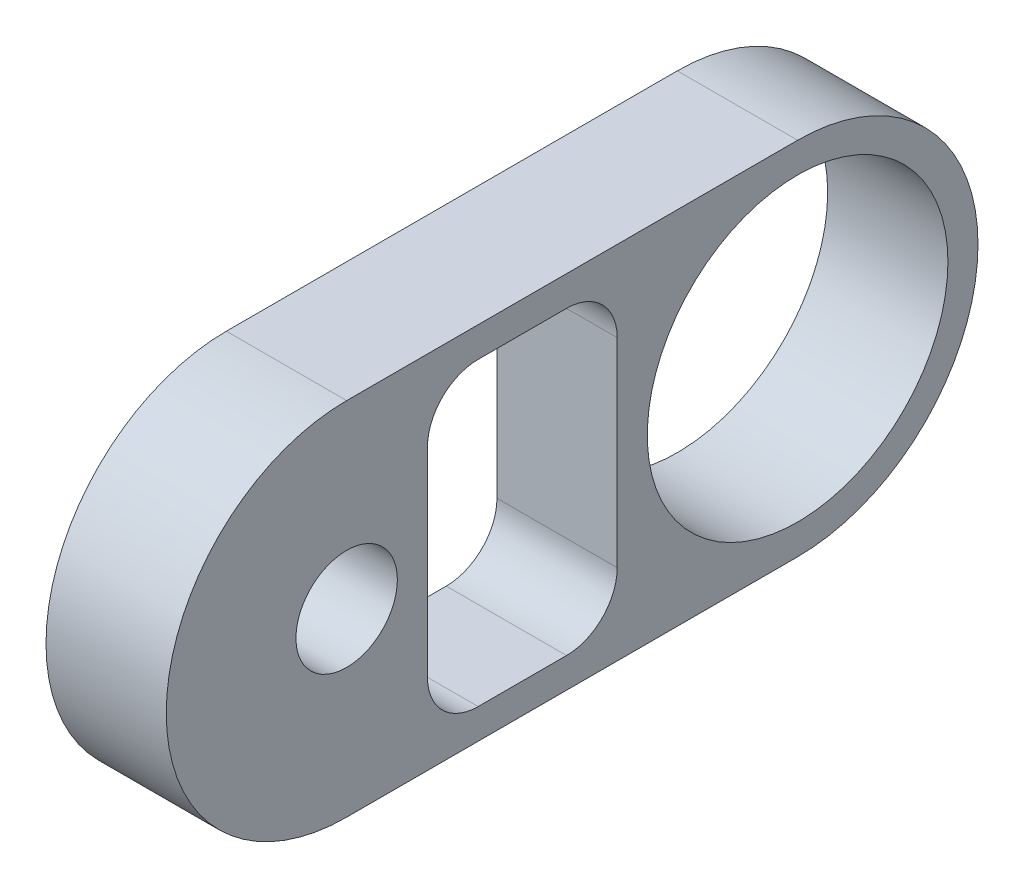
ISO-10303-21;
HEADER;
FILE_DESCRIPTION(('STEP AP214'),'2;1');
FILE_NAME('part.step','',(''),(''),'','','');
FILE_SCHEMA(('AUTOMOTIVE_DESIGN { 1 0 10303 214 1 1 1 1 }'));
ENDSEC;
DATA;
#1=APPLICATION_CONTEXT('core data for automotive mechanical design processes');
#2=APPLICATION_PROTOCOL_DEFINITION('international standard','automotive_design',2000,#1);
#3=PRODUCT_CONTEXT('',#1,'mechanical');
#4=PRODUCT('Part','Part','',(#3));
#5=PRODUCT_RELATED_PRODUCT_CATEGORY('part','',(#4));
#6=PRODUCT_DEFINITION_FORMATION('','',#4);
#7=PRODUCT_DEFINITION_CONTEXT('part definition',#1,'design');
#8=PRODUCT_DEFINITION('design','',#6,#7);
#9=PRODUCT_DEFINITION_SHAPE('','',#8);
#10=(LENGTH_UNIT() NAMED_UNIT(*) SI_UNIT(.MILLI.,.METRE.));
#11=(NAMED_UNIT(*) PLANE_ANGLE_UNIT() SI_UNIT($,.RADIAN.));
#12=(NAMED_UNIT(*) SI_UNIT($,.STERADIAN.) SOLID_ANGLE_UNIT());
#13=UNCERTAINTY_MEASURE_WITH_UNIT(LENGTH_MEASURE(1.E-05),#10,'distance_accuracy_value','');
#14=(GEOMETRIC_REPRESENTATION_CONTEXT(3) GLOBAL_UNCERTAINTY_ASSIGNED_CONTEXT((#13)) GLOBAL_UNIT_ASSIGNED_CONTEXT((#10,
#11,#12)) REPRESENTATION_CONTEXT('',''));
#15=CARTESIAN_POINT('',(0.,0.,0.));
#16=DIRECTION('',(0.,0.,1.));
#17=DIRECTION('',(1.,0.,0.));
#18=AXIS2_PLACEMENT_3D('',#15,#16,#17);
#19=CARTESIAN_POINT('',(10.1599999492,-45.6336193705345,15.3619127645357));
#20=DIRECTION('',(-1.,0.,0.));
#21=DIRECTION('',(0.,0.,1.));
#22=AXIS2_PLACEMENT_3D('',#19,#20,#21);
#23=PLANE('',#22);
#24=DIRECTION('',(0.,1.,0.));
#25=VECTOR('',#24,1.);
#26=CARTESIAN_POINT('',(10.1599999492,-58.3336193705345,-7.49808723546434));
#27=LINE('',#26,#25);
#28=CARTESIAN_POINT('',(10.1599999492,-54.0486393705345,-7.49808723546434));
#29=VERTEX_POINT('',#28);
#30=CARTESIAN_POINT('',(10.1599999492,-37.2185993705345,-7.49808723546434));
#31=VERTEX_POINT('',#30);
#32=EDGE_CURVE('E206',#29,#31,#27,.T.);
#33=ORIENTED_EDGE('',*,*,#32,.F.);
#34=CARTESIAN_POINT('',(10.1599999492,-54.0486393705345,-3.21310723546434));
#35=DIRECTION('',(-1.,0.,0.));
#36=DIRECTION('',(0.,0.,1.));
#37=AXIS2_PLACEMENT_3D('',#34,#35,#36);
#38=CIRCLE('',#37,4.28498);
#39=CARTESIAN_POINT('',(10.1599999492,-58.3336193705345,-3.21310723546434));
#40=VERTEX_POINT('',#39);
#41=EDGE_CURVE('E188',#29,#40,#38,.T.);
#42=ORIENTED_EDGE('',*,*,#41,.T.);
#43=DIRECTION('',(0.,0.,-1.));
#44=VECTOR('',#43,1.);
#45=CARTESIAN_POINT('',(10.1599999492,-58.3336193705345,8.53693276453566));
#46=LINE('',#45,#44);
#47=CARTESIAN_POINT('',(10.1599999492,-58.3336193705345,4.25195276453566));
#48=VERTEX_POINT('',#47);
#49=EDGE_CURVE('E230',#48,#40,#46,.T.);
#50=ORIENTED_EDGE('',*,*,#49,.F.);
#51=CARTESIAN_POINT('',(10.1599999492,-54.0486393705345,4.25195276453566));
#52=DIRECTION('',(-1.,0.,0.));
#53=DIRECTION('',(0.,0.,1.));
#54=AXIS2_PLACEMENT_3D('',#51,#52,#53);
#55=CIRCLE('',#54,4.28498);
#56=CARTESIAN_POINT('',(10.1599999492,-54.0486393705345,8.53693276453566));
#57=VERTEX_POINT('',#56);
#58=EDGE_CURVE('E183',#48,#57,#55,.T.);
#59=ORIENTED_EDGE('',*,*,#58,.T.);
#60=DIRECTION('',(0.,-1.,0.));
#61=VECTOR('',#60,1.);
#62=CARTESIAN_POINT('',(10.1599999492,-58.3336193705345,8.53693276453566));
#63=LINE('',#62,#61);
#64=CARTESIAN_POINT('',(10.1599999492,-37.2185993705345,8.53693276453566));
#65=VERTEX_POINT('',#64);
#66=EDGE_CURVE('E203',#65,#57,#63,.T.);
#67=ORIENTED_EDGE('',*,*,#66,.F.);
#68=CARTESIAN_POINT('',(10.1599999492,-37.2185993705345,4.25195276453566));
#69=DIRECTION('',(-1.,0.,0.));
#70=DIRECTION('',(0.,0.,1.));
#71=AXIS2_PLACEMENT_3D('',#68,#69,#70);
#72=CIRCLE('',#71,4.28498);
#73=CARTESIAN_POINT('',(10.1599999492,-32.9336193705345,4.25195276453566));
#74=VERTEX_POINT('',#73);
#75=EDGE_CURVE('E53',#65,#74,#72,.T.);
#76=ORIENTED_EDGE('',*,*,#75,.T.);
#77=DIRECTION('',(0.,0.,1.));
#78=VECTOR('',#77,1.);
#79=CARTESIAN_POINT('',(10.1599999492,-32.9336193705345,8.53693276453566));
#80=LINE('',#79,#78);
#81=CARTESIAN_POINT('',(10.1599999492,-32.9336193705345,-3.21310723546434));
#82=VERTEX_POINT('',#81);
#83=EDGE_CURVE('E200',#82,#74,#80,.T.);
#84=ORIENTED_EDGE('',*,*,#83,.F.);
#85=CARTESIAN_POINT('',(10.1599999492,-37.2185993705345,-3.21310723546434));
#86=DIRECTION('',(-1.,0.,0.));
#87=DIRECTION('',(0.,0.,1.));
#88=AXIS2_PLACEMENT_3D('',#85,#86,#87);
#89=CIRCLE('',#88,4.28498);
#90=EDGE_CURVE('E192',#82,#31,#89,.T.);
#91=ORIENTED_EDGE('',*,*,#90,.T.);
#92=EDGE_LOOP('',(#33,#42,#50,#59,#67,#76,#84,#91));
#93=FACE_BOUND('',#92,.T.);
#94=CARTESIAN_POINT('',(10.1599999492,-45.6336193705345,15.3619127645357));
#95=DIRECTION('',(1.,0.,0.));
#96=DIRECTION('',(0.,0.,1.));
#97=AXIS2_PLACEMENT_3D('',#94,#95,#96);
#98=CIRCLE('',#97,15.24);
#99=CARTESIAN_POINT('',(10.1599999492,-30.3936193705345,15.3619127645357));
#100=VERTEX_POINT('',#99);
#101=CARTESIAN_POINT('',(10.1599999492,-60.8736193705345,15.3619127645357));
#102=VERTEX_POINT('',#101);
#103=EDGE_CURVE('E150',#100,#102,#98,.T.);
#104=ORIENTED_EDGE('',*,*,#103,.T.);
#105=DIRECTION('',(0.,0.,-1.));
#106=VECTOR('',#105,1.);
#107=CARTESIAN_POINT('',(10.1599999492,-60.8736193705345,15.3619127645357));
#108=LINE('',#107,#106);
#109=CARTESIAN_POINT('',(10.1599999492,-60.8736193705345,-22.7380872354643));
#110=VERTEX_POINT('',#109);
#111=EDGE_CURVE('E136',#102,#110,#108,.T.);
#112=ORIENTED_EDGE('',*,*,#111,.T.);
#113=CARTESIAN_POINT('',(10.1599999492,-45.6336193705345,-22.7380872354643));
#114=DIRECTION('',(1.,0.,0.));
#115=DIRECTION('',(0.,0.,-1.));
#116=AXIS2_PLACEMENT_3D('',#113,#114,#115);
#117=CIRCLE('',#116,15.24);
#118=CARTESIAN_POINT('',(10.1599999492,-30.3936193705345,-22.7380872354643));
#119=VERTEX_POINT('',#118);
#120=EDGE_CURVE('E148',#110,#119,#117,.T.);
#121=ORIENTED_EDGE('',*,*,#120,.T.);
#122=DIRECTION('',(0.,0.,1.));
#123=VECTOR('',#122,1.);
#124=CARTESIAN_POINT('',(10.1599999492,-30.3936193705345,-22.7380872354643));
#125=LINE('',#124,#123);
#126=EDGE_CURVE('E155',#119,#100,#125,.T.);
#127=ORIENTED_EDGE('',*,*,#126,.T.);
#128=EDGE_LOOP('',(#104,#112,#121,#127));
#129=FACE_BOUND('',#128,.T.);
#130=CARTESIAN_POINT('',(10.1599999492,-45.6336193705345,-22.7380872354643));
#131=DIRECTION('',(1.,0.,0.));
#132=DIRECTION('',(0.,0.,-1.));
#133=AXIS2_PLACEMENT_3D('',#130,#131,#132);
#134=CIRCLE('',#133,12.7);
#135=CARTESIAN_POINT('',(10.1599999492,-45.6336193705345,-35.4380872354643));
#136=VERTEX_POINT('',#135);
#137=EDGE_CURVE('E236',#136,#136,#134,.T.);
#138=ORIENTED_EDGE('',*,*,#137,.F.);
#139=EDGE_LOOP('',(#138));
#140=FACE_BOUND('',#139,.T.);
#141=CARTESIAN_POINT('',(10.1599999492,-45.6336193705345,15.3619127645357));
#142=DIRECTION('',(1.,0.,0.));
#143=DIRECTION('',(0.,0.,-1.));
#144=AXIS2_PLACEMENT_3D('',#141,#142,#143);
#145=CIRCLE('',#144,4.28498);
#146=CARTESIAN_POINT('',(10.1599999492,-45.6336193705345,11.0769327645357));
#147=VERTEX_POINT('',#146);
#148=EDGE_CURVE('E225',#147,#147,#145,.T.);
#149=ORIENTED_EDGE('',*,*,#148,.F.);
#150=EDGE_LOOP('',(#149));
#151=FACE_BOUND('',#150,.T.);
#152=ADVANCED_FACE('F46',(#93,#129,#140,#151),#23,.F.);
#153=CARTESIAN_POINT('',(0.,-45.6336193705345,15.3619127645357));
#154=DIRECTION('',(-1.,0.,0.));
#155=DIRECTION('',(0.,0.,1.));
#156=AXIS2_PLACEMENT_3D('',#153,#154,#155);
#157=PLANE('',#156);
#158=DIRECTION('',(0.,-1.,0.));
#159=VECTOR('',#158,1.);
#160=CARTESIAN_POINT('',(0.,-58.3336193705345,8.53693276453566));
#161=LINE('',#160,#159);
#162=CARTESIAN_POINT('',(0.,-37.2185993705345,8.53693276453566));
#163=VERTEX_POINT('',#162);
#164=CARTESIAN_POINT('',(0.,-54.0486393705345,8.53693276453566));
#165=VERTEX_POINT('',#164);
#166=EDGE_CURVE('E213',#163,#165,#161,.T.);
#167=ORIENTED_EDGE('',*,*,#166,.T.);
#168=CARTESIAN_POINT('',(0.,-54.0486393705345,4.25195276453566));
#169=DIRECTION('',(-1.,0.,0.));
#170=DIRECTION('',(0.,0.,1.));
#171=AXIS2_PLACEMENT_3D('',#168,#169,#170);
#172=CIRCLE('',#171,4.28498);
#173=CARTESIAN_POINT('',(0.,-58.3336193705345,4.25195276453566));
#174=VERTEX_POINT('',#173);
#175=EDGE_CURVE('E186',#165,#174,#172,.F.);
#176=ORIENTED_EDGE('',*,*,#175,.T.);
#177=DIRECTION('',(0.,0.,-1.));
#178=VECTOR('',#177,1.);
#179=CARTESIAN_POINT('',(0.,-58.3336193705345,8.53693276453566));
#180=LINE('',#179,#178);
#181=CARTESIAN_POINT('',(0.,-58.3336193705345,-3.21310723546434));
#182=VERTEX_POINT('',#181);
#183=EDGE_CURVE('E235',#174,#182,#180,.T.);
#184=ORIENTED_EDGE('',*,*,#183,.T.);
#185=CARTESIAN_POINT('',(0.,-54.0486393705345,-3.21310723546434));
#186=DIRECTION('',(-1.,0.,0.));
#187=DIRECTION('',(0.,0.,1.));
#188=AXIS2_PLACEMENT_3D('',#185,#186,#187);
#189=CIRCLE('',#188,4.28498);
#190=CARTESIAN_POINT('',(0.,-54.0486393705345,-7.49808723546434));
#191=VERTEX_POINT('',#190);
#192=EDGE_CURVE('E191',#182,#191,#189,.F.);
#193=ORIENTED_EDGE('',*,*,#192,.T.);
#194=DIRECTION('',(0.,1.,0.));
#195=VECTOR('',#194,1.);
#196=CARTESIAN_POINT('',(0.,-58.3336193705345,-7.49808723546434));
#197=LINE('',#196,#195);
#198=CARTESIAN_POINT('',(0.,-37.2185993705345,-7.49808723546434));
#199=VERTEX_POINT('',#198);
#200=EDGE_CURVE('E221',#191,#199,#197,.T.);
#201=ORIENTED_EDGE('',*,*,#200,.T.);
#202=CARTESIAN_POINT('',(0.,-37.2185993705345,-3.21310723546434));
#203=DIRECTION('',(-1.,0.,0.));
#204=DIRECTION('',(0.,0.,1.));
#205=AXIS2_PLACEMENT_3D('',#202,#203,#204);
#206=CIRCLE('',#205,4.28498);
#207=CARTESIAN_POINT('',(0.,-32.9336193705345,-3.21310723546434));
#208=VERTEX_POINT('',#207);
#209=EDGE_CURVE('E67',#199,#208,#206,.F.);
#210=ORIENTED_EDGE('',*,*,#209,.T.);
#211=DIRECTION('',(0.,0.,1.));
#212=VECTOR('',#211,1.);
#213=CARTESIAN_POINT('',(0.,-32.9336193705345,8.53693276453566));
#214=LINE('',#213,#212);
#215=CARTESIAN_POINT('',(0.,-32.9336193705345,4.25195276453566));
#216=VERTEX_POINT('',#215);
#217=EDGE_CURVE('E214',#208,#216,#214,.T.);
#218=ORIENTED_EDGE('',*,*,#217,.T.);
#219=CARTESIAN_POINT('',(0.,-37.2185993705345,4.25195276453566));
#220=DIRECTION('',(-1.,0.,0.));
#221=DIRECTION('',(0.,0.,1.));
#222=AXIS2_PLACEMENT_3D('',#219,#220,#221);
#223=CIRCLE('',#222,4.28498);
#224=EDGE_CURVE('E11',#216,#163,#223,.F.);
#225=ORIENTED_EDGE('',*,*,#224,.T.);
#226=EDGE_LOOP('',(#167,#176,#184,#193,#201,#210,#218,#225));
#227=FACE_BOUND('',#226,.T.);
#228=CARTESIAN_POINT('',(0.,-45.6336193705345,-22.7380872354643));
#229=DIRECTION('',(1.,0.,0.));
#230=DIRECTION('',(0.,0.,-1.));
#231=AXIS2_PLACEMENT_3D('',#228,#229,#230);
#232=CIRCLE('',#231,12.7);
#233=CARTESIAN_POINT('',(0.,-45.6336193705345,-35.4380872354643));
#234=VERTEX_POINT('',#233);
#235=EDGE_CURVE('E237',#234,#234,#232,.T.);
#236=ORIENTED_EDGE('',*,*,#235,.T.);
#237=EDGE_LOOP('',(#236));
#238=FACE_BOUND('',#237,.T.);
#239=CARTESIAN_POINT('',(0.,-45.6336193705345,15.3619127645357));
#240=DIRECTION('',(1.,0.,0.));
#241=DIRECTION('',(0.,0.,1.));
#242=AXIS2_PLACEMENT_3D('',#239,#240,#241);
#243=CIRCLE('',#242,15.24);
#244=CARTESIAN_POINT('',(0.,-30.3936193705345,15.3619127645357));
#245=VERTEX_POINT('',#244);
#246=CARTESIAN_POINT('',(0.,-60.8736193705345,15.3619127645357));
#247=VERTEX_POINT('',#246);
#248=EDGE_CURVE('E159',#245,#247,#243,.T.);
#249=ORIENTED_EDGE('',*,*,#248,.F.);
#250=DIRECTION('',(0.,0.,1.));
#251=VECTOR('',#250,1.);
#252=CARTESIAN_POINT('',(0.,-30.3936193705345,-22.7380872354643));
#253=LINE('',#252,#251);
#254=CARTESIAN_POINT('',(0.,-30.3936193705345,-22.7380872354643));
#255=VERTEX_POINT('',#254);
#256=EDGE_CURVE('E156',#255,#245,#253,.T.);
#257=ORIENTED_EDGE('',*,*,#256,.F.);
#258=CARTESIAN_POINT('',(0.,-45.6336193705345,-22.7380872354643));
#259=DIRECTION('',(1.,0.,0.));
#260=DIRECTION('',(0.,0.,-1.));
#261=AXIS2_PLACEMENT_3D('',#258,#259,#260);
#262=CIRCLE('',#261,15.24);
#263=CARTESIAN_POINT('',(0.,-60.8736193705345,-22.7380872354643));
#264=VERTEX_POINT('',#263);
#265=EDGE_CURVE('E248',#264,#255,#262,.T.);
#266=ORIENTED_EDGE('',*,*,#265,.F.);
#267=DIRECTION('',(0.,0.,-1.));
#268=VECTOR('',#267,1.);
#269=CARTESIAN_POINT('',(0.,-60.8736193705345,15.3619127645357));
#270=LINE('',#269,#268);
#271=EDGE_CURVE('E250',#247,#264,#270,.T.);
#272=ORIENTED_EDGE('',*,*,#271,.F.);
#273=EDGE_LOOP('',(#249,#257,#266,#272));
#274=FACE_BOUND('',#273,.T.);
#275=CARTESIAN_POINT('',(0.,-45.6336193705345,15.3619127645357));
#276=DIRECTION('',(1.,0.,0.));
#277=DIRECTION('',(0.,0.,-1.));
#278=AXIS2_PLACEMENT_3D('',#275,#276,#277);
#279=CIRCLE('',#278,4.28498);
#280=CARTESIAN_POINT('',(0.,-45.6336193705345,11.0769327645357));
#281=VERTEX_POINT('',#280);
#282=EDGE_CURVE('E218',#281,#281,#279,.T.);
#283=ORIENTED_EDGE('',*,*,#282,.T.);
#284=EDGE_LOOP('',(#283));
#285=FACE_BOUND('',#284,.T.);
#286=ADVANCED_FACE('F211',(#227,#238,#274,#285),#157,.T.);
#287=CARTESIAN_POINT('',(10.1599999492,-45.6336193705345,15.3619127645357));
#288=DIRECTION('',(-1.,0.,0.));
#289=DIRECTION('',(0.,0.,1.));
#290=AXIS2_PLACEMENT_3D('',#287,#288,#289);
#291=CYLINDRICAL_SURFACE('',#290,15.24);
#292=ORIENTED_EDGE('',*,*,#248,.T.);
#293=DIRECTION('',(-1.,0.,0.));
#294=VECTOR('',#293,1.);
#295=CARTESIAN_POINT('',(10.1599999492,-60.8736193705345,15.3619127645357));
#296=LINE('',#295,#294);
#297=EDGE_CURVE('E139',#102,#247,#296,.T.);
#298=ORIENTED_EDGE('',*,*,#297,.F.);
#299=ORIENTED_EDGE('',*,*,#103,.F.);
#300=DIRECTION('',(-1.,0.,0.));
#301=VECTOR('',#300,1.);
#302=CARTESIAN_POINT('',(10.1599999492,-30.3936193705345,15.3619127645357));
#303=LINE('',#302,#301);
#304=EDGE_CURVE('E242',#100,#245,#303,.T.);
#305=ORIENTED_EDGE('',*,*,#304,.T.);
#306=EDGE_LOOP('',(#292,#298,#299,#305));
#307=FACE_BOUND('',#306,.T.);
#308=ADVANCED_FACE('F158',(#307),#291,.T.);
#309=CARTESIAN_POINT('',(10.1599999492,-60.8736193705345,15.3619127645357));
#310=DIRECTION('',(0.,1.,0.));
#311=DIRECTION('',(0.,0.,1.));
#312=AXIS2_PLACEMENT_3D('',#309,#310,#311);
#313=PLANE('',#312);
#314=ORIENTED_EDGE('',*,*,#271,.T.);
#315=DIRECTION('',(-1.,0.,0.));
#316=VECTOR('',#315,1.);
#317=CARTESIAN_POINT('',(10.1599999492,-60.8736193705345,-22.7380872354643));
#318=LINE('',#317,#316);
#319=EDGE_CURVE('E141',#110,#264,#318,.T.);
#320=ORIENTED_EDGE('',*,*,#319,.F.);
#321=ORIENTED_EDGE('',*,*,#111,.F.);
#322=ORIENTED_EDGE('',*,*,#297,.T.);
#323=EDGE_LOOP('',(#314,#320,#321,#322));
#324=FACE_BOUND('',#323,.T.);
#325=ADVANCED_FACE('F137',(#324),#313,.F.);
#326=CARTESIAN_POINT('',(10.1599999492,-45.6336193705345,-22.7380872354643));
#327=DIRECTION('',(-1.,0.,0.));
#328=DIRECTION('',(0.,0.,1.));
#329=AXIS2_PLACEMENT_3D('',#326,#327,#328);
#330=CYLINDRICAL_SURFACE('',#329,15.24);
#331=ORIENTED_EDGE('',*,*,#265,.T.);
#332=DIRECTION('',(-1.,0.,0.));
#333=VECTOR('',#332,1.);
#334=CARTESIAN_POINT('',(10.1599999492,-30.3936193705345,-22.7380872354643));
#335=LINE('',#334,#333);
#336=EDGE_CURVE('E164',#119,#255,#335,.T.);
#337=ORIENTED_EDGE('',*,*,#336,.F.);
#338=ORIENTED_EDGE('',*,*,#120,.F.);
#339=ORIENTED_EDGE('',*,*,#319,.T.);
#340=EDGE_LOOP('',(#331,#337,#338,#339));
#341=FACE_BOUND('',#340,.T.);
#342=ADVANCED_FACE('F261',(#341),#330,.T.);
#343=CARTESIAN_POINT('',(10.1599999492,-30.3936193705345,-22.7380872354643));
#344=DIRECTION('',(0.,-1.,0.));
#345=DIRECTION('',(0.,0.,-1.));
#346=AXIS2_PLACEMENT_3D('',#343,#344,#345);
#347=PLANE('',#346);
#348=ORIENTED_EDGE('',*,*,#256,.T.);
#349=ORIENTED_EDGE('',*,*,#304,.F.);
#350=ORIENTED_EDGE('',*,*,#126,.F.);
#351=ORIENTED_EDGE('',*,*,#336,.T.);
#352=EDGE_LOOP('',(#348,#349,#350,#351));
#353=FACE_BOUND('',#352,.T.);
#354=ADVANCED_FACE('F258',(#353),#347,.F.);
#355=CARTESIAN_POINT('',(10.1599999492,-45.6336193705345,-22.7380872354643));
#356=DIRECTION('',(-1.,0.,0.));
#357=DIRECTION('',(0.,0.,1.));
#358=AXIS2_PLACEMENT_3D('',#355,#356,#357);
#359=CYLINDRICAL_SURFACE('',#358,12.7);
#360=ORIENTED_EDGE('',*,*,#137,.T.);
#361=EDGE_LOOP('',(#360));
#362=FACE_BOUND('',#361,.T.);
#363=ORIENTED_EDGE('',*,*,#235,.F.);
#364=EDGE_LOOP('',(#363));
#365=FACE_BOUND('',#364,.T.);
#366=ADVANCED_FACE('F268',(#362,#365),#359,.F.);
#367=CARTESIAN_POINT('',(10.1599999492,-45.6336193705345,15.3619127645357));
#368=DIRECTION('',(-1.,0.,0.));
#369=DIRECTION('',(0.,0.,1.));
#370=AXIS2_PLACEMENT_3D('',#367,#368,#369);
#371=CYLINDRICAL_SURFACE('',#370,4.28498);
#372=ORIENTED_EDGE('',*,*,#148,.T.);
#373=EDGE_LOOP('',(#372));
#374=FACE_BOUND('',#373,.T.);
#375=ORIENTED_EDGE('',*,*,#282,.F.);
#376=EDGE_LOOP('',(#375));
#377=FACE_BOUND('',#376,.T.);
#378=ADVANCED_FACE('F278',(#374,#377),#371,.F.);
#379=CARTESIAN_POINT('',(0.,-58.3336193705345,8.53693276453566));
#380=DIRECTION('',(0.,-1.,0.));
#381=DIRECTION('',(0.,0.,-1.));
#382=AXIS2_PLACEMENT_3D('',#379,#380,#381);
#383=PLANE('',#382);
#384=ORIENTED_EDGE('',*,*,#183,.F.);
#385=DIRECTION('',(1.,0.,0.));
#386=VECTOR('',#385,1.);
#387=CARTESIAN_POINT('',(10.1599999492,-58.3336193705345,4.25195276453566));
#388=LINE('',#387,#386);
#389=EDGE_CURVE('E162',#174,#48,#388,.T.);
#390=ORIENTED_EDGE('',*,*,#389,.T.);
#391=ORIENTED_EDGE('',*,*,#49,.T.);
#392=DIRECTION('',(1.,0.,0.));
#393=VECTOR('',#392,1.);
#394=CARTESIAN_POINT('',(0.,-58.3336193705345,-3.21310723546434));
#395=LINE('',#394,#393);
#396=EDGE_CURVE('E161',#40,#182,#395,.F.);
#397=ORIENTED_EDGE('',*,*,#396,.T.);
#398=EDGE_LOOP('',(#384,#390,#391,#397));
#399=FACE_BOUND('',#398,.T.);
#400=ADVANCED_FACE('F283',(#399),#383,.F.);
#401=CARTESIAN_POINT('',(0.,-58.3336193705345,8.53693276453566));
#402=DIRECTION('',(0.,0.,1.));
#403=DIRECTION('',(1.,0.,0.));
#404=AXIS2_PLACEMENT_3D('',#401,#402,#403);
#405=PLANE('',#404);
#406=ORIENTED_EDGE('',*,*,#66,.T.);
#407=DIRECTION('',(1.,0.,0.));
#408=VECTOR('',#407,1.);
#409=CARTESIAN_POINT('',(0.,-54.0486393705345,8.53693276453566));
#410=LINE('',#409,#408);
#411=EDGE_CURVE('E173',#57,#165,#410,.F.);
#412=ORIENTED_EDGE('',*,*,#411,.T.);
#413=ORIENTED_EDGE('',*,*,#166,.F.);
#414=DIRECTION('',(1.,0.,0.));
#415=VECTOR('',#414,1.);
#416=CARTESIAN_POINT('',(10.1599999492,-37.2185993705345,8.53693276453566));
#417=LINE('',#416,#415);
#418=EDGE_CURVE('E174',#163,#65,#417,.T.);
#419=ORIENTED_EDGE('',*,*,#418,.T.);
#420=EDGE_LOOP('',(#406,#412,#413,#419));
#421=FACE_BOUND('',#420,.T.);
#422=ADVANCED_FACE('F220',(#421),#405,.F.);
#423=CARTESIAN_POINT('',(0.,-32.9336193705345,8.53693276453566));
#424=DIRECTION('',(0.,1.,0.));
#425=DIRECTION('',(0.,0.,1.));
#426=AXIS2_PLACEMENT_3D('',#423,#424,#425);
#427=PLANE('',#426);
#428=ORIENTED_EDGE('',*,*,#217,.F.);
#429=DIRECTION('',(1.,0.,0.));
#430=VECTOR('',#429,1.);
#431=CARTESIAN_POINT('',(10.1599999492,-32.9336193705345,-3.21310723546434));
#432=LINE('',#431,#430);
#433=EDGE_CURVE('E185',#208,#82,#432,.T.);
#434=ORIENTED_EDGE('',*,*,#433,.T.);
#435=ORIENTED_EDGE('',*,*,#83,.T.);
#436=DIRECTION('',(1.,0.,0.));
#437=VECTOR('',#436,1.);
#438=CARTESIAN_POINT('',(0.,-32.9336193705345,4.25195276453566));
#439=LINE('',#438,#437);
#440=EDGE_CURVE('E64',#74,#216,#439,.F.);
#441=ORIENTED_EDGE('',*,*,#440,.T.);
#442=EDGE_LOOP('',(#428,#434,#435,#441));
#443=FACE_BOUND('',#442,.T.);
#444=ADVANCED_FACE('F204',(#443),#427,.F.);
#445=CARTESIAN_POINT('',(0.,-58.3336193705345,-7.49808723546434));
#446=DIRECTION('',(0.,0.,-1.));
#447=DIRECTION('',(-1.,0.,0.));
#448=AXIS2_PLACEMENT_3D('',#445,#446,#447);
#449=PLANE('',#448);
#450=ORIENTED_EDGE('',*,*,#200,.F.);
#451=DIRECTION('',(1.,0.,0.));
#452=VECTOR('',#451,1.);
#453=CARTESIAN_POINT('',(10.1599999492,-54.0486393705345,-7.49808723546434));
#454=LINE('',#453,#452);
#455=EDGE_CURVE('E177',#191,#29,#454,.T.);
#456=ORIENTED_EDGE('',*,*,#455,.T.);
#457=ORIENTED_EDGE('',*,*,#32,.T.);
#458=DIRECTION('',(1.,0.,0.));
#459=VECTOR('',#458,1.);
#460=CARTESIAN_POINT('',(0.,-37.2185993705345,-7.49808723546434));
#461=LINE('',#460,#459);
#462=EDGE_CURVE('E178',#31,#199,#461,.F.);
#463=ORIENTED_EDGE('',*,*,#462,.T.);
#464=EDGE_LOOP('',(#450,#456,#457,#463));
#465=FACE_BOUND('',#464,.T.);
#466=ADVANCED_FACE('F290',(#465),#449,.F.);
#467=CARTESIAN_POINT('',(0.,-54.0486393705345,4.25195276453566));
#468=DIRECTION('',(-1.,0.,0.));
#469=DIRECTION('',(0.,0.,1.));
#470=AXIS2_PLACEMENT_3D('',#467,#468,#469);
#471=CYLINDRICAL_SURFACE('',#470,4.28498);
#472=ORIENTED_EDGE('',*,*,#175,.F.);
#473=ORIENTED_EDGE('',*,*,#411,.F.);
#474=ORIENTED_EDGE('',*,*,#58,.F.);
#475=ORIENTED_EDGE('',*,*,#389,.F.);
#476=EDGE_LOOP('',(#472,#473,#474,#475));
#477=FACE_BOUND('',#476,.T.);
#478=ADVANCED_FACE('F295',(#477),#471,.F.);
#479=CARTESIAN_POINT('',(0.,-54.0486393705345,-3.21310723546434));
#480=DIRECTION('',(-1.,0.,0.));
#481=DIRECTION('',(0.,0.,1.));
#482=AXIS2_PLACEMENT_3D('',#479,#480,#481);
#483=CYLINDRICAL_SURFACE('',#482,4.28498);
#484=ORIENTED_EDGE('',*,*,#192,.F.);
#485=ORIENTED_EDGE('',*,*,#396,.F.);
#486=ORIENTED_EDGE('',*,*,#41,.F.);
#487=ORIENTED_EDGE('',*,*,#455,.F.);
#488=EDGE_LOOP('',(#484,#485,#486,#487));
#489=FACE_BOUND('',#488,.T.);
#490=ADVANCED_FACE('F318',(#489),#483,.F.);
#491=CARTESIAN_POINT('',(0.,-37.2185993705345,-3.21310723546434));
#492=DIRECTION('',(-1.,0.,0.));
#493=DIRECTION('',(0.,0.,1.));
#494=AXIS2_PLACEMENT_3D('',#491,#492,#493);
#495=CYLINDRICAL_SURFACE('',#494,4.28498);
#496=ORIENTED_EDGE('',*,*,#209,.F.);
#497=ORIENTED_EDGE('',*,*,#462,.F.);
#498=ORIENTED_EDGE('',*,*,#90,.F.);
#499=ORIENTED_EDGE('',*,*,#433,.F.);
#500=EDGE_LOOP('',(#496,#497,#498,#499));
#501=FACE_BOUND('',#500,.T.);
#502=ADVANCED_FACE('F330',(#501),#495,.F.);
#503=CARTESIAN_POINT('',(0.,-37.2185993705345,4.25195276453566));
#504=DIRECTION('',(-1.,0.,0.));
#505=DIRECTION('',(0.,0.,1.));
#506=AXIS2_PLACEMENT_3D('',#503,#504,#505);
#507=CYLINDRICAL_SURFACE('',#506,4.28498);
#508=ORIENTED_EDGE('',*,*,#224,.F.);
#509=ORIENTED_EDGE('',*,*,#440,.F.);
#510=ORIENTED_EDGE('',*,*,#75,.F.);
#511=ORIENTED_EDGE('',*,*,#418,.F.);
#512=EDGE_LOOP('',(#508,#509,#510,#511));
#513=FACE_BOUND('',#512,.T.);
#514=ADVANCED_FACE('F48',(#513),#507,.F.);
#515=CLOSED_SHELL('',(#152,#286,#308,#325,#342,#354,#366,#378,#400,#422,#444,#466,#478,#490,
#502,#514));
#516=MANIFOLD_SOLID_BREP('B2',#515);
#517=ADVANCED_BREP_SHAPE_REPRESENTATION('',(#18,#516),#14);
#518=SHAPE_DEFINITION_REPRESENTATION(#9,#517);
ENDSEC;
END-ISO-10303-21;
